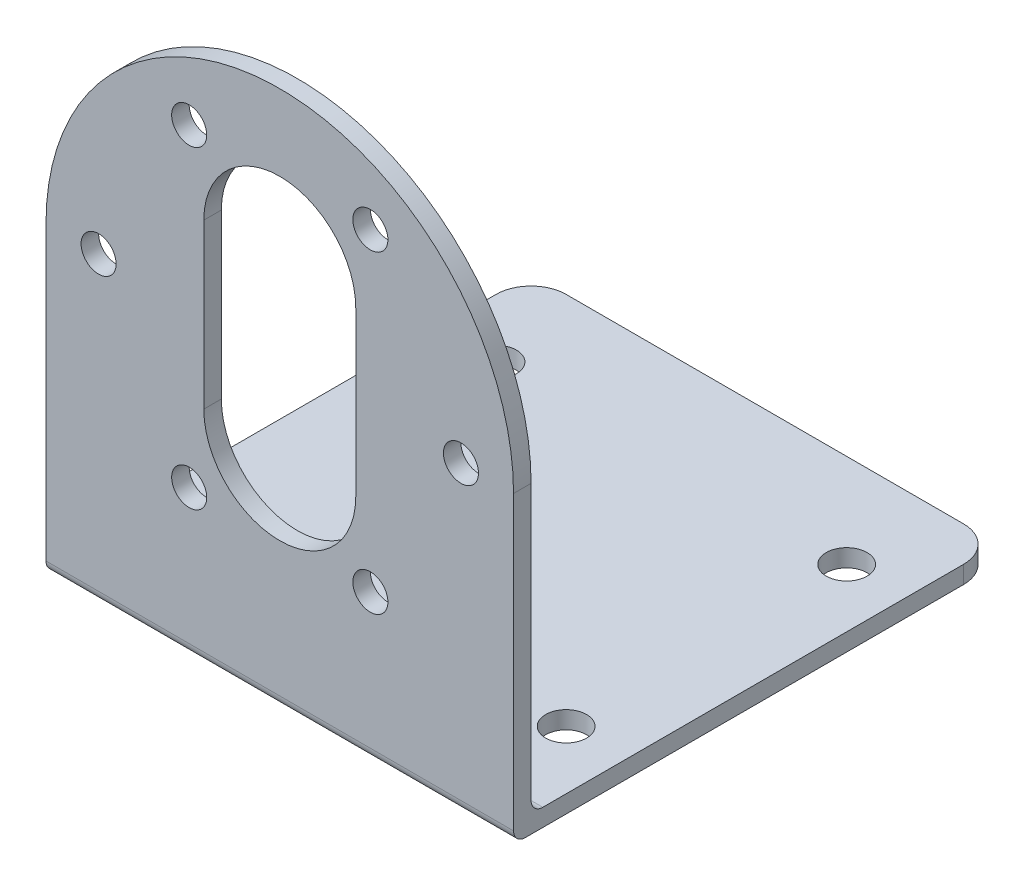
ISO-10303-21;
HEADER;
FILE_DESCRIPTION(('STEP AP214'),'2;1');
FILE_NAME('part.step','',(''),(''),'','','');
FILE_SCHEMA(('AUTOMOTIVE_DESIGN { 1 0 10303 214 1 1 1 1 }'));
ENDSEC;
DATA;
#1=APPLICATION_CONTEXT('core data for automotive mechanical design processes');
#2=APPLICATION_PROTOCOL_DEFINITION('international standard','automotive_design',2000,#1);
#3=PRODUCT_CONTEXT('',#1,'mechanical');
#4=PRODUCT('Part','Part','',(#3));
#5=PRODUCT_RELATED_PRODUCT_CATEGORY('part','',(#4));
#6=PRODUCT_DEFINITION_FORMATION('','',#4);
#7=PRODUCT_DEFINITION_CONTEXT('part definition',#1,'design');
#8=PRODUCT_DEFINITION('design','',#6,#7);
#9=PRODUCT_DEFINITION_SHAPE('','',#8);
#10=(LENGTH_UNIT() NAMED_UNIT(*) SI_UNIT(.MILLI.,.METRE.));
#11=(NAMED_UNIT(*) PLANE_ANGLE_UNIT() SI_UNIT($,.RADIAN.));
#12=(NAMED_UNIT(*) SI_UNIT($,.STERADIAN.) SOLID_ANGLE_UNIT());
#13=UNCERTAINTY_MEASURE_WITH_UNIT(LENGTH_MEASURE(1.E-05),#10,'distance_accuracy_value','');
#14=(GEOMETRIC_REPRESENTATION_CONTEXT(3) GLOBAL_UNCERTAINTY_ASSIGNED_CONTEXT((#13)) GLOBAL_UNIT_ASSIGNED_CONTEXT((#10,
#11,#12)) REPRESENTATION_CONTEXT('',''));
#15=CARTESIAN_POINT('',(0.,0.,0.));
#16=DIRECTION('',(0.,0.,1.));
#17=DIRECTION('',(1.,0.,0.));
#18=AXIS2_PLACEMENT_3D('',#15,#16,#17);
#19=CARTESIAN_POINT('',(0.,0.,0.));
#20=DIRECTION('',(0.,0.,1.));
#21=DIRECTION('',(1.,0.,0.));
#22=AXIS2_PLACEMENT_3D('',#19,#20,#21);
#23=PLANE('',#22);
#24=CARTESIAN_POINT('',(-7.74999999999999,13.4233937586588,0.));
#25=DIRECTION('',(0.,0.,1.));
#26=DIRECTION('',(1.,0.,0.));
#27=AXIS2_PLACEMENT_3D('',#24,#25,#26);
#28=CIRCLE('',#27,1.5);
#29=CARTESIAN_POINT('',(-6.25,13.4233937586588,0.));
#30=VERTEX_POINT('',#29);
#31=EDGE_CURVE('E220',#30,#30,#28,.T.);
#32=ORIENTED_EDGE('',*,*,#31,.T.);
#33=EDGE_LOOP('',(#32));
#34=FACE_BOUND('',#33,.T.);
#35=CARTESIAN_POINT('',(7.75,13.4233937586595,0.));
#36=DIRECTION('',(0.,0.,1.));
#37=DIRECTION('',(1.,0.,0.));
#38=AXIS2_PLACEMENT_3D('',#35,#36,#37);
#39=CIRCLE('',#38,1.50000000000049);
#40=CARTESIAN_POINT('',(9.25000000000049,13.4233937586595,0.));
#41=VERTEX_POINT('',#40);
#42=EDGE_CURVE('E217',#41,#41,#39,.T.);
#43=ORIENTED_EDGE('',*,*,#42,.T.);
#44=EDGE_LOOP('',(#43));
#45=FACE_BOUND('',#44,.T.);
#46=CARTESIAN_POINT('',(15.5000000000006,9.82237548156137E-13,0.));
#47=DIRECTION('',(0.,0.,1.));
#48=DIRECTION('',(1.,0.,0.));
#49=AXIS2_PLACEMENT_3D('',#46,#47,#48);
#50=CIRCLE('',#49,1.50000000000116);
#51=CARTESIAN_POINT('',(17.0000000000017,9.82237548156137E-13,0.));
#52=VERTEX_POINT('',#51);
#53=EDGE_CURVE('E214',#52,#52,#50,.T.);
#54=ORIENTED_EDGE('',*,*,#53,.T.);
#55=EDGE_LOOP('',(#54));
#56=FACE_BOUND('',#55,.T.);
#57=CARTESIAN_POINT('',(7.75000000000114,-13.4233937586582,0.));
#58=DIRECTION('',(0.,0.,1.));
#59=DIRECTION('',(1.,0.,0.));
#60=AXIS2_PLACEMENT_3D('',#57,#58,#59);
#61=CIRCLE('',#60,1.50000000000139);
#62=CARTESIAN_POINT('',(9.25000000000253,-13.4233937586582,0.));
#63=VERTEX_POINT('',#62);
#64=EDGE_CURVE('E211',#63,#63,#61,.T.);
#65=ORIENTED_EDGE('',*,*,#64,.T.);
#66=EDGE_LOOP('',(#65));
#67=FACE_BOUND('',#66,.T.);
#68=CARTESIAN_POINT('',(-7.74999999999886,-13.4233937586588,0.));
#69=DIRECTION('',(0.,0.,1.));
#70=DIRECTION('',(1.,0.,0.));
#71=AXIS2_PLACEMENT_3D('',#68,#69,#70);
#72=CIRCLE('',#71,1.50000000000098);
#73=CARTESIAN_POINT('',(-6.24999999999788,-13.4233937586588,0.));
#74=VERTEX_POINT('',#73);
#75=EDGE_CURVE('E208',#74,#74,#72,.T.);
#76=ORIENTED_EDGE('',*,*,#75,.T.);
#77=EDGE_LOOP('',(#76));
#78=FACE_BOUND('',#77,.T.);
#79=CARTESIAN_POINT('',(-15.4999999999994,-3.38655138568742E-13,0.));
#80=DIRECTION('',(0.,0.,1.));
#81=DIRECTION('',(1.,0.,0.));
#82=AXIS2_PLACEMENT_3D('',#79,#80,#81);
#83=CIRCLE('',#82,1.50000000000039);
#84=CARTESIAN_POINT('',(-13.9999999999991,-3.38655138568742E-13,0.));
#85=VERTEX_POINT('',#84);
#86=EDGE_CURVE('E205',#85,#85,#83,.T.);
#87=ORIENTED_EDGE('',*,*,#86,.T.);
#88=EDGE_LOOP('',(#87));
#89=FACE_BOUND('',#88,.T.);
#90=CARTESIAN_POINT('',(0.,-7.,0.));
#91=DIRECTION('',(0.,0.,1.));
#92=DIRECTION('',(1.,0.,0.));
#93=AXIS2_PLACEMENT_3D('',#90,#91,#92);
#94=CIRCLE('',#93,6.5);
#95=CARTESIAN_POINT('',(-6.5,-7.,0.));
#96=VERTEX_POINT('',#95);
#97=CARTESIAN_POINT('',(6.5,-7.,0.));
#98=VERTEX_POINT('',#97);
#99=EDGE_CURVE('E142',#96,#98,#94,.T.);
#100=ORIENTED_EDGE('',*,*,#99,.T.);
#101=DIRECTION('',(0.,-1.,0.));
#102=VECTOR('',#101,1.);
#103=CARTESIAN_POINT('',(6.5,0.,0.));
#104=LINE('',#103,#102);
#105=CARTESIAN_POINT('',(6.5,7.,0.));
#106=VERTEX_POINT('',#105);
#107=EDGE_CURVE('E202',#106,#98,#104,.T.);
#108=ORIENTED_EDGE('',*,*,#107,.F.);
#109=CARTESIAN_POINT('',(0.,7.,0.));
#110=DIRECTION('',(0.,0.,1.));
#111=DIRECTION('',(1.,0.,0.));
#112=AXIS2_PLACEMENT_3D('',#109,#110,#111);
#113=CIRCLE('',#112,6.5);
#114=CARTESIAN_POINT('',(-6.5,7.,0.));
#115=VERTEX_POINT('',#114);
#116=EDGE_CURVE('E200',#115,#106,#113,.F.);
#117=ORIENTED_EDGE('',*,*,#116,.F.);
#118=DIRECTION('',(0.,-1.,0.));
#119=VECTOR('',#118,1.);
#120=CARTESIAN_POINT('',(-6.5,0.,0.));
#121=LINE('',#120,#119);
#122=EDGE_CURVE('E197',#115,#96,#121,.T.);
#123=ORIENTED_EDGE('',*,*,#122,.T.);
#124=EDGE_LOOP('',(#100,#108,#117,#123));
#125=FACE_BOUND('',#124,.T.);
#126=DIRECTION('',(0.,-1.,0.));
#127=VECTOR('',#126,1.);
#128=CARTESIAN_POINT('',(20.,0.,0.));
#129=LINE('',#128,#127);
#130=CARTESIAN_POINT('',(20.,0.,0.));
#131=VERTEX_POINT('',#130);
#132=CARTESIAN_POINT('',(20.,-23.5,0.));
#133=VERTEX_POINT('',#132);
#134=EDGE_CURVE('E223',#131,#133,#129,.T.);
#135=ORIENTED_EDGE('',*,*,#134,.T.);
#136=DIRECTION('',(1.,0.,0.));
#137=VECTOR('',#136,1.);
#138=CARTESIAN_POINT('',(-20.,-23.5,0.));
#139=LINE('',#138,#137);
#140=CARTESIAN_POINT('',(-20.,-23.5,0.));
#141=VERTEX_POINT('',#140);
#142=EDGE_CURVE('E51',#133,#141,#139,.F.);
#143=ORIENTED_EDGE('',*,*,#142,.T.);
#144=DIRECTION('',(0.,-1.,0.));
#145=VECTOR('',#144,1.);
#146=CARTESIAN_POINT('',(-20.,0.,0.));
#147=LINE('',#146,#145);
#148=CARTESIAN_POINT('',(-20.,0.,0.));
#149=VERTEX_POINT('',#148);
#150=EDGE_CURVE('E158',#149,#141,#147,.T.);
#151=ORIENTED_EDGE('',*,*,#150,.F.);
#152=CARTESIAN_POINT('',(0.,0.,0.));
#153=DIRECTION('',(0.,0.,1.));
#154=DIRECTION('',(1.,0.,0.));
#155=AXIS2_PLACEMENT_3D('',#152,#153,#154);
#156=CIRCLE('',#155,20.);
#157=EDGE_CURVE('E225',#131,#149,#156,.T.);
#158=ORIENTED_EDGE('',*,*,#157,.F.);
#159=EDGE_LOOP('',(#135,#143,#151,#158));
#160=FACE_BOUND('',#159,.T.);
#161=ADVANCED_FACE('F36',(#34,#45,#56,#67,#78,#89,#125,#160),#23,.F.);
#162=CARTESIAN_POINT('',(20.,0.,1.5));
#163=DIRECTION('',(1.,0.,0.));
#164=DIRECTION('',(0.,1.,0.));
#165=AXIS2_PLACEMENT_3D('',#162,#163,#164);
#166=PLANE('',#165);
#167=DIRECTION('',(0.,-1.,0.));
#168=VECTOR('',#167,1.);
#169=CARTESIAN_POINT('',(20.,0.,1.5));
#170=LINE('',#169,#168);
#171=CARTESIAN_POINT('',(20.,0.,1.5));
#172=VERTEX_POINT('',#171);
#173=CARTESIAN_POINT('',(20.,-25.,1.5));
#174=VERTEX_POINT('',#173);
#175=EDGE_CURVE('E186',#172,#174,#170,.T.);
#176=ORIENTED_EDGE('',*,*,#175,.T.);
#177=CARTESIAN_POINT('',(20.,-25.,0.5));
#178=DIRECTION('',(1.,0.,0.));
#179=DIRECTION('',(0.,1.,0.));
#180=AXIS2_PLACEMENT_3D('',#177,#178,#179);
#181=CIRCLE('',#180,1.);
#182=CARTESIAN_POINT('',(20.,-26.,0.5));
#183=VERTEX_POINT('',#182);
#184=EDGE_CURVE('E265',#174,#183,#181,.T.);
#185=ORIENTED_EDGE('',*,*,#184,.T.);
#186=DIRECTION('',(0.,0.,-1.));
#187=VECTOR('',#186,1.);
#188=CARTESIAN_POINT('',(20.,-26.,1.5));
#189=LINE('',#188,#187);
#190=CARTESIAN_POINT('',(20.,-26.,-37.));
#191=VERTEX_POINT('',#190);
#192=EDGE_CURVE('E147',#183,#191,#189,.T.);
#193=ORIENTED_EDGE('',*,*,#192,.T.);
#194=DIRECTION('',(0.,-1.,0.));
#195=VECTOR('',#194,1.);
#196=CARTESIAN_POINT('',(20.,-24.5,-37.));
#197=LINE('',#196,#195);
#198=CARTESIAN_POINT('',(20.,-24.5,-37.));
#199=VERTEX_POINT('',#198);
#200=EDGE_CURVE('E253',#191,#199,#197,.F.);
#201=ORIENTED_EDGE('',*,*,#200,.T.);
#202=DIRECTION('',(0.,0.,1.));
#203=VECTOR('',#202,1.);
#204=CARTESIAN_POINT('',(20.,-24.5,-40.));
#205=LINE('',#204,#203);
#206=CARTESIAN_POINT('',(20.,-24.5,-1.));
#207=VERTEX_POINT('',#206);
#208=EDGE_CURVE('E279',#199,#207,#205,.T.);
#209=ORIENTED_EDGE('',*,*,#208,.T.);
#210=CARTESIAN_POINT('',(20.,-23.5,-1.));
#211=DIRECTION('',(1.,0.,0.));
#212=DIRECTION('',(0.,1.,0.));
#213=AXIS2_PLACEMENT_3D('',#210,#211,#212);
#214=CIRCLE('',#213,1.);
#215=EDGE_CURVE('E44',#207,#133,#214,.F.);
#216=ORIENTED_EDGE('',*,*,#215,.T.);
#217=ORIENTED_EDGE('',*,*,#134,.F.);
#218=DIRECTION('',(0.,0.,-1.));
#219=VECTOR('',#218,1.);
#220=CARTESIAN_POINT('',(20.,0.,1.5));
#221=LINE('',#220,#219);
#222=EDGE_CURVE('E235',#172,#131,#221,.T.);
#223=ORIENTED_EDGE('',*,*,#222,.F.);
#224=EDGE_LOOP('',(#176,#185,#193,#201,#209,#216,#217,#223));
#225=FACE_BOUND('',#224,.T.);
#226=ADVANCED_FACE('F277',(#225),#166,.T.);
#227=CARTESIAN_POINT('',(0.,0.,1.5));
#228=DIRECTION('',(0.,0.,-1.));
#229=DIRECTION('',(-1.,0.,0.));
#230=AXIS2_PLACEMENT_3D('',#227,#228,#229);
#231=CYLINDRICAL_SURFACE('',#230,20.);
#232=ORIENTED_EDGE('',*,*,#157,.T.);
#233=DIRECTION('',(0.,0.,-1.));
#234=VECTOR('',#233,1.);
#235=CARTESIAN_POINT('',(-20.,0.,1.5));
#236=LINE('',#235,#234);
#237=CARTESIAN_POINT('',(-20.,0.,1.5));
#238=VERTEX_POINT('',#237);
#239=EDGE_CURVE('E232',#238,#149,#236,.T.);
#240=ORIENTED_EDGE('',*,*,#239,.F.);
#241=CARTESIAN_POINT('',(0.,0.,1.5));
#242=DIRECTION('',(0.,0.,1.));
#243=DIRECTION('',(1.,0.,0.));
#244=AXIS2_PLACEMENT_3D('',#241,#242,#243);
#245=CIRCLE('',#244,20.);
#246=EDGE_CURVE('E189',#172,#238,#245,.T.);
#247=ORIENTED_EDGE('',*,*,#246,.F.);
#248=ORIENTED_EDGE('',*,*,#222,.T.);
#249=EDGE_LOOP('',(#232,#240,#247,#248));
#250=FACE_BOUND('',#249,.T.);
#251=ADVANCED_FACE('F362',(#250),#231,.T.);
#252=CARTESIAN_POINT('',(-20.,0.,1.5));
#253=DIRECTION('',(1.,0.,0.));
#254=DIRECTION('',(0.,1.,0.));
#255=AXIS2_PLACEMENT_3D('',#252,#253,#254);
#256=PLANE('',#255);
#257=DIRECTION('',(0.,0.,-1.));
#258=VECTOR('',#257,1.);
#259=CARTESIAN_POINT('',(-20.,-26.,1.5));
#260=LINE('',#259,#258);
#261=CARTESIAN_POINT('',(-20.,-26.,0.5));
#262=VERTEX_POINT('',#261);
#263=CARTESIAN_POINT('',(-20.,-26.,-37.));
#264=VERTEX_POINT('',#263);
#265=EDGE_CURVE('E230',#262,#264,#260,.T.);
#266=ORIENTED_EDGE('',*,*,#265,.F.);
#267=CARTESIAN_POINT('',(-20.,-25.,0.5));
#268=DIRECTION('',(1.,0.,0.));
#269=DIRECTION('',(0.,1.,0.));
#270=AXIS2_PLACEMENT_3D('',#267,#268,#269);
#271=CIRCLE('',#270,1.);
#272=CARTESIAN_POINT('',(-20.,-25.,1.5));
#273=VERTEX_POINT('',#272);
#274=EDGE_CURVE('E269',#262,#273,#271,.F.);
#275=ORIENTED_EDGE('',*,*,#274,.T.);
#276=DIRECTION('',(0.,-1.,0.));
#277=VECTOR('',#276,1.);
#278=CARTESIAN_POINT('',(-20.,0.,1.5));
#279=LINE('',#278,#277);
#280=EDGE_CURVE('E192',#238,#273,#279,.T.);
#281=ORIENTED_EDGE('',*,*,#280,.F.);
#282=ORIENTED_EDGE('',*,*,#239,.T.);
#283=ORIENTED_EDGE('',*,*,#150,.T.);
#284=CARTESIAN_POINT('',(-20.,-23.5,-1.));
#285=DIRECTION('',(1.,0.,0.));
#286=DIRECTION('',(0.,1.,0.));
#287=AXIS2_PLACEMENT_3D('',#284,#285,#286);
#288=CIRCLE('',#287,1.);
#289=CARTESIAN_POINT('',(-20.,-24.5,-1.));
#290=VERTEX_POINT('',#289);
#291=EDGE_CURVE('E11',#141,#290,#288,.T.);
#292=ORIENTED_EDGE('',*,*,#291,.T.);
#293=DIRECTION('',(0.,0.,1.));
#294=VECTOR('',#293,1.);
#295=CARTESIAN_POINT('',(-20.,-24.5,-40.));
#296=LINE('',#295,#294);
#297=CARTESIAN_POINT('',(-20.,-24.5,-37.));
#298=VERTEX_POINT('',#297);
#299=EDGE_CURVE('E198',#298,#290,#296,.T.);
#300=ORIENTED_EDGE('',*,*,#299,.F.);
#301=DIRECTION('',(0.,1.,0.));
#302=VECTOR('',#301,1.);
#303=CARTESIAN_POINT('',(-20.,0.,-37.));
#304=LINE('',#303,#302);
#305=EDGE_CURVE('E259',#298,#264,#304,.F.);
#306=ORIENTED_EDGE('',*,*,#305,.T.);
#307=EDGE_LOOP('',(#266,#275,#281,#282,#283,#292,#300,#306));
#308=FACE_BOUND('',#307,.T.);
#309=ADVANCED_FACE('F356',(#308),#256,.F.);
#310=CARTESIAN_POINT('',(0.,-7.,1.5));
#311=DIRECTION('',(0.,0.,-1.));
#312=DIRECTION('',(-1.,0.,0.));
#313=AXIS2_PLACEMENT_3D('',#310,#311,#312);
#314=CYLINDRICAL_SURFACE('',#313,6.5);
#315=ORIENTED_EDGE('',*,*,#99,.F.);
#316=DIRECTION('',(0.,0.,-1.));
#317=VECTOR('',#316,1.);
#318=CARTESIAN_POINT('',(-6.5,-7.,1.5));
#319=LINE('',#318,#317);
#320=CARTESIAN_POINT('',(-6.5,-7.,1.5));
#321=VERTEX_POINT('',#320);
#322=EDGE_CURVE('E137',#321,#96,#319,.T.);
#323=ORIENTED_EDGE('',*,*,#322,.F.);
#324=CARTESIAN_POINT('',(0.,-7.,1.5));
#325=DIRECTION('',(0.,0.,1.));
#326=DIRECTION('',(1.,0.,0.));
#327=AXIS2_PLACEMENT_3D('',#324,#325,#326);
#328=CIRCLE('',#327,6.5);
#329=CARTESIAN_POINT('',(6.5,-7.,1.5));
#330=VERTEX_POINT('',#329);
#331=EDGE_CURVE('E140',#321,#330,#328,.T.);
#332=ORIENTED_EDGE('',*,*,#331,.T.);
#333=DIRECTION('',(0.,0.,-1.));
#334=VECTOR('',#333,1.);
#335=CARTESIAN_POINT('',(6.5,-7.,1.5));
#336=LINE('',#335,#334);
#337=EDGE_CURVE('E195',#330,#98,#336,.T.);
#338=ORIENTED_EDGE('',*,*,#337,.T.);
#339=EDGE_LOOP('',(#315,#323,#332,#338));
#340=FACE_BOUND('',#339,.T.);
#341=ADVANCED_FACE('F139',(#340),#314,.F.);
#342=CARTESIAN_POINT('',(-6.5,0.,1.5));
#343=DIRECTION('',(1.,0.,0.));
#344=DIRECTION('',(0.,1.,0.));
#345=AXIS2_PLACEMENT_3D('',#342,#343,#344);
#346=PLANE('',#345);
#347=ORIENTED_EDGE('',*,*,#122,.F.);
#348=DIRECTION('',(0.,0.,-1.));
#349=VECTOR('',#348,1.);
#350=CARTESIAN_POINT('',(-6.5,7.,1.5));
#351=LINE('',#350,#349);
#352=CARTESIAN_POINT('',(-6.5,7.,1.5));
#353=VERTEX_POINT('',#352);
#354=EDGE_CURVE('E148',#353,#115,#351,.T.);
#355=ORIENTED_EDGE('',*,*,#354,.F.);
#356=DIRECTION('',(0.,-1.,0.));
#357=VECTOR('',#356,1.);
#358=CARTESIAN_POINT('',(-6.5,0.,1.5));
#359=LINE('',#358,#357);
#360=EDGE_CURVE('E154',#353,#321,#359,.T.);
#361=ORIENTED_EDGE('',*,*,#360,.T.);
#362=ORIENTED_EDGE('',*,*,#322,.T.);
#363=EDGE_LOOP('',(#347,#355,#361,#362));
#364=FACE_BOUND('',#363,.T.);
#365=ADVANCED_FACE('F160',(#364),#346,.T.);
#366=CARTESIAN_POINT('',(0.,7.,1.5));
#367=DIRECTION('',(0.,0.,-1.));
#368=DIRECTION('',(-1.,0.,0.));
#369=AXIS2_PLACEMENT_3D('',#366,#367,#368);
#370=CYLINDRICAL_SURFACE('',#369,6.5);
#371=ORIENTED_EDGE('',*,*,#116,.T.);
#372=DIRECTION('',(0.,0.,-1.));
#373=VECTOR('',#372,1.);
#374=CARTESIAN_POINT('',(6.5,7.,1.5));
#375=LINE('',#374,#373);
#376=CARTESIAN_POINT('',(6.5,7.,1.5));
#377=VERTEX_POINT('',#376);
#378=EDGE_CURVE('E239',#377,#106,#375,.T.);
#379=ORIENTED_EDGE('',*,*,#378,.F.);
#380=CARTESIAN_POINT('',(0.,7.,1.5));
#381=DIRECTION('',(0.,0.,1.));
#382=DIRECTION('',(1.,0.,0.));
#383=AXIS2_PLACEMENT_3D('',#380,#381,#382);
#384=CIRCLE('',#383,6.5);
#385=EDGE_CURVE('E162',#353,#377,#384,.F.);
#386=ORIENTED_EDGE('',*,*,#385,.F.);
#387=ORIENTED_EDGE('',*,*,#354,.T.);
#388=EDGE_LOOP('',(#371,#379,#386,#387));
#389=FACE_BOUND('',#388,.T.);
#390=ADVANCED_FACE('F560',(#389),#370,.F.);
#391=CARTESIAN_POINT('',(-7.74999999999999,13.4233937586588,1.5));
#392=DIRECTION('',(0.,0.,-1.));
#393=DIRECTION('',(-1.,0.,0.));
#394=AXIS2_PLACEMENT_3D('',#391,#392,#393);
#395=CYLINDRICAL_SURFACE('',#394,1.5);
#396=CARTESIAN_POINT('',(-7.74999999999999,13.4233937586588,1.5));
#397=DIRECTION('',(0.,0.,1.));
#398=DIRECTION('',(1.,0.,0.));
#399=AXIS2_PLACEMENT_3D('',#396,#397,#398);
#400=CIRCLE('',#399,1.5);
#401=CARTESIAN_POINT('',(-6.25,13.4233937586588,1.5));
#402=VERTEX_POINT('',#401);
#403=EDGE_CURVE('E183',#402,#402,#400,.T.);
#404=ORIENTED_EDGE('',*,*,#403,.T.);
#405=EDGE_LOOP('',(#404));
#406=FACE_BOUND('',#405,.T.);
#407=ORIENTED_EDGE('',*,*,#31,.F.);
#408=EDGE_LOOP('',(#407));
#409=FACE_BOUND('',#408,.T.);
#410=ADVANCED_FACE('F550',(#406,#409),#395,.F.);
#411=CARTESIAN_POINT('',(7.75,13.4233937586595,1.5));
#412=DIRECTION('',(0.,0.,-1.));
#413=DIRECTION('',(-1.,0.,0.));
#414=AXIS2_PLACEMENT_3D('',#411,#412,#413);
#415=CYLINDRICAL_SURFACE('',#414,1.50000000000049);
#416=CARTESIAN_POINT('',(7.75,13.4233937586595,1.5));
#417=DIRECTION('',(0.,0.,1.));
#418=DIRECTION('',(1.,0.,0.));
#419=AXIS2_PLACEMENT_3D('',#416,#417,#418);
#420=CIRCLE('',#419,1.50000000000049);
#421=CARTESIAN_POINT('',(9.25000000000049,13.4233937586595,1.5));
#422=VERTEX_POINT('',#421);
#423=EDGE_CURVE('E180',#422,#422,#420,.T.);
#424=ORIENTED_EDGE('',*,*,#423,.T.);
#425=EDGE_LOOP('',(#424));
#426=FACE_BOUND('',#425,.T.);
#427=ORIENTED_EDGE('',*,*,#42,.F.);
#428=EDGE_LOOP('',(#427));
#429=FACE_BOUND('',#428,.T.);
#430=ADVANCED_FACE('F540',(#426,#429),#415,.F.);
#431=CARTESIAN_POINT('',(15.5000000000006,9.82237548156137E-13,1.5));
#432=DIRECTION('',(0.,0.,-1.));
#433=DIRECTION('',(-1.,0.,0.));
#434=AXIS2_PLACEMENT_3D('',#431,#432,#433);
#435=CYLINDRICAL_SURFACE('',#434,1.50000000000116);
#436=CARTESIAN_POINT('',(15.5000000000006,9.82237548156137E-13,1.5));
#437=DIRECTION('',(0.,0.,1.));
#438=DIRECTION('',(1.,0.,0.));
#439=AXIS2_PLACEMENT_3D('',#436,#437,#438);
#440=CIRCLE('',#439,1.50000000000116);
#441=CARTESIAN_POINT('',(17.0000000000017,9.82237548156137E-13,1.5));
#442=VERTEX_POINT('',#441);
#443=EDGE_CURVE('E177',#442,#442,#440,.T.);
#444=ORIENTED_EDGE('',*,*,#443,.T.);
#445=EDGE_LOOP('',(#444));
#446=FACE_BOUND('',#445,.T.);
#447=ORIENTED_EDGE('',*,*,#53,.F.);
#448=EDGE_LOOP('',(#447));
#449=FACE_BOUND('',#448,.T.);
#450=ADVANCED_FACE('F530',(#446,#449),#435,.F.);
#451=CARTESIAN_POINT('',(7.75000000000114,-13.4233937586582,1.5));
#452=DIRECTION('',(0.,0.,-1.));
#453=DIRECTION('',(-1.,0.,0.));
#454=AXIS2_PLACEMENT_3D('',#451,#452,#453);
#455=CYLINDRICAL_SURFACE('',#454,1.50000000000139);
#456=CARTESIAN_POINT('',(7.75000000000114,-13.4233937586582,1.5));
#457=DIRECTION('',(0.,0.,1.));
#458=DIRECTION('',(1.,0.,0.));
#459=AXIS2_PLACEMENT_3D('',#456,#457,#458);
#460=CIRCLE('',#459,1.50000000000139);
#461=CARTESIAN_POINT('',(9.25000000000253,-13.4233937586582,1.5));
#462=VERTEX_POINT('',#461);
#463=EDGE_CURVE('E174',#462,#462,#460,.T.);
#464=ORIENTED_EDGE('',*,*,#463,.T.);
#465=EDGE_LOOP('',(#464));
#466=FACE_BOUND('',#465,.T.);
#467=ORIENTED_EDGE('',*,*,#64,.F.);
#468=EDGE_LOOP('',(#467));
#469=FACE_BOUND('',#468,.T.);
#470=ADVANCED_FACE('F520',(#466,#469),#455,.F.);
#471=CARTESIAN_POINT('',(-7.74999999999886,-13.4233937586588,1.5));
#472=DIRECTION('',(0.,0.,-1.));
#473=DIRECTION('',(-1.,0.,0.));
#474=AXIS2_PLACEMENT_3D('',#471,#472,#473);
#475=CYLINDRICAL_SURFACE('',#474,1.50000000000098);
#476=CARTESIAN_POINT('',(-7.74999999999886,-13.4233937586588,1.5));
#477=DIRECTION('',(0.,0.,1.));
#478=DIRECTION('',(1.,0.,0.));
#479=AXIS2_PLACEMENT_3D('',#476,#477,#478);
#480=CIRCLE('',#479,1.50000000000098);
#481=CARTESIAN_POINT('',(-6.24999999999788,-13.4233937586588,1.5));
#482=VERTEX_POINT('',#481);
#483=EDGE_CURVE('E171',#482,#482,#480,.T.);
#484=ORIENTED_EDGE('',*,*,#483,.T.);
#485=EDGE_LOOP('',(#484));
#486=FACE_BOUND('',#485,.T.);
#487=ORIENTED_EDGE('',*,*,#75,.F.);
#488=EDGE_LOOP('',(#487));
#489=FACE_BOUND('',#488,.T.);
#490=ADVANCED_FACE('F510',(#486,#489),#475,.F.);
#491=CARTESIAN_POINT('',(-15.4999999999994,-3.38655138568742E-13,1.5));
#492=DIRECTION('',(0.,0.,-1.));
#493=DIRECTION('',(-1.,0.,0.));
#494=AXIS2_PLACEMENT_3D('',#491,#492,#493);
#495=CYLINDRICAL_SURFACE('',#494,1.50000000000039);
#496=CARTESIAN_POINT('',(-15.4999999999994,-3.38655138568742E-13,1.5));
#497=DIRECTION('',(0.,0.,1.));
#498=DIRECTION('',(1.,0.,0.));
#499=AXIS2_PLACEMENT_3D('',#496,#497,#498);
#500=CIRCLE('',#499,1.50000000000039);
#501=CARTESIAN_POINT('',(-13.9999999999991,-3.38655138568742E-13,1.5));
#502=VERTEX_POINT('',#501);
#503=EDGE_CURVE('E168',#502,#502,#500,.T.);
#504=ORIENTED_EDGE('',*,*,#503,.T.);
#505=EDGE_LOOP('',(#504));
#506=FACE_BOUND('',#505,.T.);
#507=ORIENTED_EDGE('',*,*,#86,.F.);
#508=EDGE_LOOP('',(#507));
#509=FACE_BOUND('',#508,.T.);
#510=ADVANCED_FACE('F500',(#506,#509),#495,.F.);
#511=CARTESIAN_POINT('',(6.5,0.,1.5));
#512=DIRECTION('',(1.,0.,0.));
#513=DIRECTION('',(0.,1.,0.));
#514=AXIS2_PLACEMENT_3D('',#511,#512,#513);
#515=PLANE('',#514);
#516=ORIENTED_EDGE('',*,*,#107,.T.);
#517=ORIENTED_EDGE('',*,*,#337,.F.);
#518=DIRECTION('',(0.,-1.,0.));
#519=VECTOR('',#518,1.);
#520=CARTESIAN_POINT('',(6.5,0.,1.5));
#521=LINE('',#520,#519);
#522=EDGE_CURVE('E156',#377,#330,#521,.T.);
#523=ORIENTED_EDGE('',*,*,#522,.F.);
#524=ORIENTED_EDGE('',*,*,#378,.T.);
#525=EDGE_LOOP('',(#516,#517,#523,#524));
#526=FACE_BOUND('',#525,.T.);
#527=ADVANCED_FACE('F344',(#526),#515,.F.);
#528=CARTESIAN_POINT('',(0.,-26.,1.5));
#529=DIRECTION('',(0.,1.,0.));
#530=DIRECTION('',(0.,0.,1.));
#531=AXIS2_PLACEMENT_3D('',#528,#529,#530);
#532=PLANE('',#531);
#533=CARTESIAN_POINT('',(-15.,-26.,-8.));
#534=DIRECTION('',(0.,1.,0.));
#535=DIRECTION('',(0.,0.,1.));
#536=AXIS2_PLACEMENT_3D('',#533,#534,#535);
#537=CIRCLE('',#536,1.75);
#538=CARTESIAN_POINT('',(-15.,-26.,-6.25));
#539=VERTEX_POINT('',#538);
#540=EDGE_CURVE('E302',#539,#539,#537,.T.);
#541=ORIENTED_EDGE('',*,*,#540,.T.);
#542=EDGE_LOOP('',(#541));
#543=FACE_BOUND('',#542,.T.);
#544=CARTESIAN_POINT('',(15.,-26.,-8.));
#545=DIRECTION('',(0.,1.,0.));
#546=DIRECTION('',(0.,0.,1.));
#547=AXIS2_PLACEMENT_3D('',#544,#545,#546);
#548=CIRCLE('',#547,1.75000000000001);
#549=CARTESIAN_POINT('',(15.,-26.,-6.24999999999999));
#550=VERTEX_POINT('',#549);
#551=EDGE_CURVE('E305',#550,#550,#548,.T.);
#552=ORIENTED_EDGE('',*,*,#551,.T.);
#553=EDGE_LOOP('',(#552));
#554=FACE_BOUND('',#553,.T.);
#555=CARTESIAN_POINT('',(15.,-26.,-32.));
#556=DIRECTION('',(0.,1.,0.));
#557=DIRECTION('',(0.,0.,1.));
#558=AXIS2_PLACEMENT_3D('',#555,#556,#557);
#559=CIRCLE('',#558,1.75);
#560=CARTESIAN_POINT('',(15.,-26.,-30.25));
#561=VERTEX_POINT('',#560);
#562=EDGE_CURVE('E308',#561,#561,#559,.T.);
#563=ORIENTED_EDGE('',*,*,#562,.T.);
#564=EDGE_LOOP('',(#563));
#565=FACE_BOUND('',#564,.T.);
#566=CARTESIAN_POINT('',(-15.,-26.,-32.));
#567=DIRECTION('',(0.,1.,0.));
#568=DIRECTION('',(0.,0.,1.));
#569=AXIS2_PLACEMENT_3D('',#566,#567,#568);
#570=CIRCLE('',#569,1.75);
#571=CARTESIAN_POINT('',(-15.,-26.,-30.25));
#572=VERTEX_POINT('',#571);
#573=EDGE_CURVE('E296',#572,#572,#570,.T.);
#574=ORIENTED_EDGE('',*,*,#573,.T.);
#575=EDGE_LOOP('',(#574));
#576=FACE_BOUND('',#575,.T.);
#577=ORIENTED_EDGE('',*,*,#192,.F.);
#578=DIRECTION('',(1.,0.,0.));
#579=VECTOR('',#578,1.);
#580=CARTESIAN_POINT('',(-20.,-26.,0.5));
#581=LINE('',#580,#579);
#582=EDGE_CURVE('E267',#183,#262,#581,.F.);
#583=ORIENTED_EDGE('',*,*,#582,.T.);
#584=ORIENTED_EDGE('',*,*,#265,.T.);
#585=CARTESIAN_POINT('',(-17.,-26.,-37.));
#586=DIRECTION('',(0.,1.,0.));
#587=DIRECTION('',(0.,0.,1.));
#588=AXIS2_PLACEMENT_3D('',#585,#586,#587);
#589=CIRCLE('',#588,3.);
#590=CARTESIAN_POINT('',(-17.,-26.,-40.));
#591=VERTEX_POINT('',#590);
#592=EDGE_CURVE('E248',#264,#591,#589,.F.);
#593=ORIENTED_EDGE('',*,*,#592,.T.);
#594=DIRECTION('',(-1.,0.,0.));
#595=VECTOR('',#594,1.);
#596=CARTESIAN_POINT('',(20.,-26.,-40.));
#597=LINE('',#596,#595);
#598=CARTESIAN_POINT('',(17.,-26.,-40.));
#599=VERTEX_POINT('',#598);
#600=EDGE_CURVE('E293',#599,#591,#597,.T.);
#601=ORIENTED_EDGE('',*,*,#600,.F.);
#602=CARTESIAN_POINT('',(17.,-26.,-37.));
#603=DIRECTION('',(0.,1.,0.));
#604=DIRECTION('',(0.,0.,1.));
#605=AXIS2_PLACEMENT_3D('',#602,#603,#604);
#606=CIRCLE('',#605,3.);
#607=EDGE_CURVE('E250',#599,#191,#606,.F.);
#608=ORIENTED_EDGE('',*,*,#607,.T.);
#609=EDGE_LOOP('',(#577,#583,#584,#593,#601,#608));
#610=FACE_BOUND('',#609,.T.);
#611=ADVANCED_FACE('F341',(#543,#554,#565,#576,#610),#532,.F.);
#612=CARTESIAN_POINT('',(0.,0.,1.5));
#613=DIRECTION('',(0.,0.,1.));
#614=DIRECTION('',(1.,0.,0.));
#615=AXIS2_PLACEMENT_3D('',#612,#613,#614);
#616=PLANE('',#615);
#617=ORIENTED_EDGE('',*,*,#331,.F.);
#618=ORIENTED_EDGE('',*,*,#360,.F.);
#619=ORIENTED_EDGE('',*,*,#385,.T.);
#620=ORIENTED_EDGE('',*,*,#522,.T.);
#621=EDGE_LOOP('',(#617,#618,#619,#620));
#622=FACE_BOUND('',#621,.T.);
#623=ORIENTED_EDGE('',*,*,#503,.F.);
#624=EDGE_LOOP('',(#623));
#625=FACE_BOUND('',#624,.T.);
#626=ORIENTED_EDGE('',*,*,#483,.F.);
#627=EDGE_LOOP('',(#626));
#628=FACE_BOUND('',#627,.T.);
#629=ORIENTED_EDGE('',*,*,#463,.F.);
#630=EDGE_LOOP('',(#629));
#631=FACE_BOUND('',#630,.T.);
#632=ORIENTED_EDGE('',*,*,#443,.F.);
#633=EDGE_LOOP('',(#632));
#634=FACE_BOUND('',#633,.T.);
#635=ORIENTED_EDGE('',*,*,#423,.F.);
#636=EDGE_LOOP('',(#635));
#637=FACE_BOUND('',#636,.T.);
#638=ORIENTED_EDGE('',*,*,#403,.F.);
#639=EDGE_LOOP('',(#638));
#640=FACE_BOUND('',#639,.T.);
#641=ORIENTED_EDGE('',*,*,#280,.T.);
#642=DIRECTION('',(1.,0.,0.));
#643=VECTOR('',#642,1.);
#644=CARTESIAN_POINT('',(20.,-25.,1.5));
#645=LINE('',#644,#643);
#646=EDGE_CURVE('E262',#273,#174,#645,.T.);
#647=ORIENTED_EDGE('',*,*,#646,.T.);
#648=ORIENTED_EDGE('',*,*,#175,.F.);
#649=ORIENTED_EDGE('',*,*,#246,.T.);
#650=EDGE_LOOP('',(#641,#647,#648,#649));
#651=FACE_BOUND('',#650,.T.);
#652=ADVANCED_FACE('F152',(#622,#625,#628,#631,#634,#637,#640,#651),#616,.T.);
#653=CARTESIAN_POINT('',(20.,-24.5,-40.));
#654=DIRECTION('',(0.,-1.,0.));
#655=DIRECTION('',(0.,0.,-1.));
#656=AXIS2_PLACEMENT_3D('',#653,#654,#655);
#657=PLANE('',#656);
#658=CARTESIAN_POINT('',(-15.,-24.5,-8.));
#659=DIRECTION('',(0.,1.,0.));
#660=DIRECTION('',(0.,0.,1.));
#661=AXIS2_PLACEMENT_3D('',#658,#659,#660);
#662=CIRCLE('',#661,1.75);
#663=CARTESIAN_POINT('',(-15.,-24.5,-6.25));
#664=VERTEX_POINT('',#663);
#665=EDGE_CURVE('E311',#664,#664,#662,.T.);
#666=ORIENTED_EDGE('',*,*,#665,.F.);
#667=EDGE_LOOP('',(#666));
#668=FACE_BOUND('',#667,.T.);
#669=CARTESIAN_POINT('',(15.,-24.5,-8.));
#670=DIRECTION('',(0.,1.,0.));
#671=DIRECTION('',(0.,0.,-1.));
#672=AXIS2_PLACEMENT_3D('',#669,#670,#671);
#673=CIRCLE('',#672,1.75000000000001);
#674=CARTESIAN_POINT('',(15.,-24.5,-9.75000000000002));
#675=VERTEX_POINT('',#674);
#676=EDGE_CURVE('E315',#675,#675,#673,.T.);
#677=ORIENTED_EDGE('',*,*,#676,.F.);
#678=EDGE_LOOP('',(#677));
#679=FACE_BOUND('',#678,.T.);
#680=CARTESIAN_POINT('',(15.,-24.5,-32.));
#681=DIRECTION('',(0.,1.,0.));
#682=DIRECTION('',(0.,0.,-1.));
#683=AXIS2_PLACEMENT_3D('',#680,#681,#682);
#684=CIRCLE('',#683,1.75);
#685=CARTESIAN_POINT('',(15.,-24.5,-33.75));
#686=VERTEX_POINT('',#685);
#687=EDGE_CURVE('E312',#686,#686,#684,.T.);
#688=ORIENTED_EDGE('',*,*,#687,.F.);
#689=EDGE_LOOP('',(#688));
#690=FACE_BOUND('',#689,.T.);
#691=CARTESIAN_POINT('',(-15.,-24.5,-32.));
#692=DIRECTION('',(0.,1.,0.));
#693=DIRECTION('',(0.,0.,1.));
#694=AXIS2_PLACEMENT_3D('',#691,#692,#693);
#695=CIRCLE('',#694,1.75);
#696=CARTESIAN_POINT('',(-15.,-24.5,-30.25));
#697=VERTEX_POINT('',#696);
#698=EDGE_CURVE('E299',#697,#697,#695,.T.);
#699=ORIENTED_EDGE('',*,*,#698,.F.);
#700=EDGE_LOOP('',(#699));
#701=FACE_BOUND('',#700,.T.);
#702=ORIENTED_EDGE('',*,*,#299,.T.);
#703=DIRECTION('',(1.,0.,0.));
#704=VECTOR('',#703,1.);
#705=CARTESIAN_POINT('',(20.,-24.5,-1.));
#706=LINE('',#705,#704);
#707=EDGE_CURVE('E271',#290,#207,#706,.T.);
#708=ORIENTED_EDGE('',*,*,#707,.T.);
#709=ORIENTED_EDGE('',*,*,#208,.F.);
#710=CARTESIAN_POINT('',(17.,-24.5,-37.));
#711=DIRECTION('',(0.,-1.,0.));
#712=DIRECTION('',(0.,0.,-1.));
#713=AXIS2_PLACEMENT_3D('',#710,#711,#712);
#714=CIRCLE('',#713,3.);
#715=CARTESIAN_POINT('',(17.,-24.5,-40.));
#716=VERTEX_POINT('',#715);
#717=EDGE_CURVE('E257',#199,#716,#714,.F.);
#718=ORIENTED_EDGE('',*,*,#717,.T.);
#719=DIRECTION('',(1.,0.,0.));
#720=VECTOR('',#719,1.);
#721=CARTESIAN_POINT('',(20.,-24.5,-40.));
#722=LINE('',#721,#720);
#723=CARTESIAN_POINT('',(-17.,-24.5,-40.));
#724=VERTEX_POINT('',#723);
#725=EDGE_CURVE('E288',#724,#716,#722,.T.);
#726=ORIENTED_EDGE('',*,*,#725,.F.);
#727=CARTESIAN_POINT('',(-17.,-24.5,-37.));
#728=DIRECTION('',(0.,-1.,0.));
#729=DIRECTION('',(0.,0.,-1.));
#730=AXIS2_PLACEMENT_3D('',#727,#728,#729);
#731=CIRCLE('',#730,3.);
#732=EDGE_CURVE('E255',#724,#298,#731,.F.);
#733=ORIENTED_EDGE('',*,*,#732,.T.);
#734=EDGE_LOOP('',(#702,#708,#709,#718,#726,#733));
#735=FACE_BOUND('',#734,.T.);
#736=ADVANCED_FACE('F284',(#668,#679,#690,#701,#735),#657,.F.);
#737=CARTESIAN_POINT('',(0.,0.,-40.));
#738=DIRECTION('',(0.,0.,1.));
#739=DIRECTION('',(1.,0.,0.));
#740=AXIS2_PLACEMENT_3D('',#737,#738,#739);
#741=PLANE('',#740);
#742=ORIENTED_EDGE('',*,*,#725,.T.);
#743=DIRECTION('',(0.,-1.,0.));
#744=VECTOR('',#743,1.);
#745=CARTESIAN_POINT('',(17.,-26.,-40.));
#746=LINE('',#745,#744);
#747=EDGE_CURVE('E245',#716,#599,#746,.T.);
#748=ORIENTED_EDGE('',*,*,#747,.T.);
#749=ORIENTED_EDGE('',*,*,#600,.T.);
#750=DIRECTION('',(0.,1.,0.));
#751=VECTOR('',#750,1.);
#752=CARTESIAN_POINT('',(-17.,0.,-40.));
#753=LINE('',#752,#751);
#754=EDGE_CURVE('E237',#591,#724,#753,.T.);
#755=ORIENTED_EDGE('',*,*,#754,.T.);
#756=EDGE_LOOP('',(#742,#748,#749,#755));
#757=FACE_BOUND('',#756,.T.);
#758=ADVANCED_FACE('F326',(#757),#741,.F.);
#759=CARTESIAN_POINT('',(-15.,-64.5,-32.));
#760=DIRECTION('',(0.,1.,0.));
#761=DIRECTION('',(0.,0.,1.));
#762=AXIS2_PLACEMENT_3D('',#759,#760,#761);
#763=CYLINDRICAL_SURFACE('',#762,1.75);
#764=ORIENTED_EDGE('',*,*,#698,.T.);
#765=EDGE_LOOP('',(#764));
#766=FACE_BOUND('',#765,.T.);
#767=ORIENTED_EDGE('',*,*,#573,.F.);
#768=EDGE_LOOP('',(#767));
#769=FACE_BOUND('',#768,.T.);
#770=ADVANCED_FACE('F334',(#766,#769),#763,.F.);
#771=CARTESIAN_POINT('',(15.,-64.5,-32.));
#772=DIRECTION('',(0.,1.,0.));
#773=DIRECTION('',(0.,0.,1.));
#774=AXIS2_PLACEMENT_3D('',#771,#772,#773);
#775=CYLINDRICAL_SURFACE('',#774,1.75);
#776=ORIENTED_EDGE('',*,*,#687,.T.);
#777=EDGE_LOOP('',(#776));
#778=FACE_BOUND('',#777,.T.);
#779=ORIENTED_EDGE('',*,*,#562,.F.);
#780=EDGE_LOOP('',(#779));
#781=FACE_BOUND('',#780,.T.);
#782=ADVANCED_FACE('F337',(#778,#781),#775,.F.);
#783=CARTESIAN_POINT('',(15.,-64.5,-8.));
#784=DIRECTION('',(0.,1.,0.));
#785=DIRECTION('',(0.,0.,1.));
#786=AXIS2_PLACEMENT_3D('',#783,#784,#785);
#787=CYLINDRICAL_SURFACE('',#786,1.75000000000001);
#788=ORIENTED_EDGE('',*,*,#676,.T.);
#789=EDGE_LOOP('',(#788));
#790=FACE_BOUND('',#789,.T.);
#791=ORIENTED_EDGE('',*,*,#551,.F.);
#792=EDGE_LOOP('',(#791));
#793=FACE_BOUND('',#792,.T.);
#794=ADVANCED_FACE('F385',(#790,#793),#787,.F.);
#795=CARTESIAN_POINT('',(-15.,-64.5,-8.));
#796=DIRECTION('',(0.,1.,0.));
#797=DIRECTION('',(0.,0.,1.));
#798=AXIS2_PLACEMENT_3D('',#795,#796,#797);
#799=CYLINDRICAL_SURFACE('',#798,1.75);
#800=ORIENTED_EDGE('',*,*,#665,.T.);
#801=EDGE_LOOP('',(#800));
#802=FACE_BOUND('',#801,.T.);
#803=ORIENTED_EDGE('',*,*,#540,.F.);
#804=EDGE_LOOP('',(#803));
#805=FACE_BOUND('',#804,.T.);
#806=ADVANCED_FACE('F321',(#802,#805),#799,.F.);
#807=CARTESIAN_POINT('',(17.,0.,-37.));
#808=DIRECTION('',(0.,1.,0.));
#809=DIRECTION('',(-1.,0.,0.));
#810=AXIS2_PLACEMENT_3D('',#807,#808,#809);
#811=CYLINDRICAL_SURFACE('',#810,3.);
#812=ORIENTED_EDGE('',*,*,#717,.F.);
#813=ORIENTED_EDGE('',*,*,#200,.F.);
#814=ORIENTED_EDGE('',*,*,#607,.F.);
#815=ORIENTED_EDGE('',*,*,#747,.F.);
#816=EDGE_LOOP('',(#812,#813,#814,#815));
#817=FACE_BOUND('',#816,.T.);
#818=ADVANCED_FACE('F391',(#817),#811,.T.);
#819=CARTESIAN_POINT('',(-17.,0.,-37.));
#820=DIRECTION('',(0.,1.,0.));
#821=DIRECTION('',(-1.,0.,0.));
#822=AXIS2_PLACEMENT_3D('',#819,#820,#821);
#823=CYLINDRICAL_SURFACE('',#822,3.);
#824=ORIENTED_EDGE('',*,*,#592,.F.);
#825=ORIENTED_EDGE('',*,*,#305,.F.);
#826=ORIENTED_EDGE('',*,*,#732,.F.);
#827=ORIENTED_EDGE('',*,*,#754,.F.);
#828=EDGE_LOOP('',(#824,#825,#826,#827));
#829=FACE_BOUND('',#828,.T.);
#830=ADVANCED_FACE('F395',(#829),#823,.T.);
#831=CARTESIAN_POINT('',(0.,-25.,0.5));
#832=DIRECTION('',(-1.,0.,0.));
#833=DIRECTION('',(0.,0.,1.));
#834=AXIS2_PLACEMENT_3D('',#831,#832,#833);
#835=CYLINDRICAL_SURFACE('',#834,1.);
#836=ORIENTED_EDGE('',*,*,#274,.F.);
#837=ORIENTED_EDGE('',*,*,#582,.F.);
#838=ORIENTED_EDGE('',*,*,#184,.F.);
#839=ORIENTED_EDGE('',*,*,#646,.F.);
#840=EDGE_LOOP('',(#836,#837,#838,#839));
#841=FACE_BOUND('',#840,.T.);
#842=ADVANCED_FACE('F354',(#841),#835,.T.);
#843=CARTESIAN_POINT('',(20.,-23.5,-1.));
#844=DIRECTION('',(-1.,0.,0.));
#845=DIRECTION('',(0.,0.,1.));
#846=AXIS2_PLACEMENT_3D('',#843,#844,#845);
#847=CYLINDRICAL_SURFACE('',#846,1.);
#848=ORIENTED_EDGE('',*,*,#291,.F.);
#849=ORIENTED_EDGE('',*,*,#142,.F.);
#850=ORIENTED_EDGE('',*,*,#215,.F.);
#851=ORIENTED_EDGE('',*,*,#707,.F.);
#852=EDGE_LOOP('',(#848,#849,#850,#851));
#853=FACE_BOUND('',#852,.T.);
#854=ADVANCED_FACE('F38',(#853),#847,.F.);
#855=CLOSED_SHELL('',(#161,#226,#251,#309,#341,#365,#390,#410,#430,#450,#470,#490,#510,#527,
#611,#652,#736,#758,#770,#782,#794,#806,#818,#830,#842,#854));
#856=MANIFOLD_SOLID_BREP('B2',#855);
#857=ADVANCED_BREP_SHAPE_REPRESENTATION('',(#18,#856),#14);
#858=SHAPE_DEFINITION_REPRESENTATION(#9,#857);
ENDSEC;
END-ISO-10303-21;
